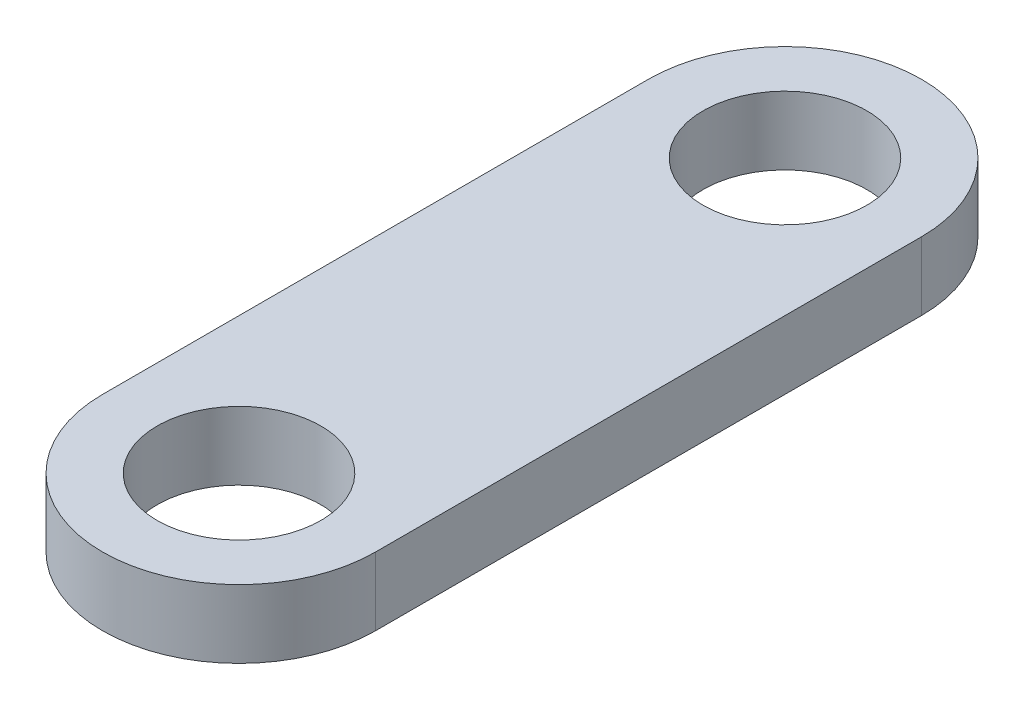
ISO-10303-21;
HEADER;
FILE_DESCRIPTION(('STEP AP214'),'2;1');
FILE_NAME('part.step','',(''),(''),'','','');
FILE_SCHEMA(('AUTOMOTIVE_DESIGN { 1 0 10303 214 1 1 1 1 }'));
ENDSEC;
DATA;
#1=APPLICATION_CONTEXT('core data for automotive mechanical design processes');
#2=APPLICATION_PROTOCOL_DEFINITION('international standard','automotive_design',2000,#1);
#3=PRODUCT_CONTEXT('',#1,'mechanical');
#4=PRODUCT('Part','Part','',(#3));
#5=PRODUCT_RELATED_PRODUCT_CATEGORY('part','',(#4));
#6=PRODUCT_DEFINITION_FORMATION('','',#4);
#7=PRODUCT_DEFINITION_CONTEXT('part definition',#1,'design');
#8=PRODUCT_DEFINITION('design','',#6,#7);
#9=PRODUCT_DEFINITION_SHAPE('','',#8);
#10=(LENGTH_UNIT() NAMED_UNIT(*) SI_UNIT(.MILLI.,.METRE.));
#11=(NAMED_UNIT(*) PLANE_ANGLE_UNIT() SI_UNIT($,.RADIAN.));
#12=(NAMED_UNIT(*) SI_UNIT($,.STERADIAN.) SOLID_ANGLE_UNIT());
#13=UNCERTAINTY_MEASURE_WITH_UNIT(LENGTH_MEASURE(1.E-05),#10,'distance_accuracy_value','');
#14=(GEOMETRIC_REPRESENTATION_CONTEXT(3) GLOBAL_UNCERTAINTY_ASSIGNED_CONTEXT((#13)) GLOBAL_UNIT_ASSIGNED_CONTEXT((#10,
#11,#12)) REPRESENTATION_CONTEXT('',''));
#15=CARTESIAN_POINT('',(0.,0.,0.));
#16=DIRECTION('',(0.,0.,1.));
#17=DIRECTION('',(1.,0.,0.));
#18=AXIS2_PLACEMENT_3D('',#15,#16,#17);
#19=CARTESIAN_POINT('',(0.,3.,0.));
#20=DIRECTION('',(0.,1.,0.));
#21=DIRECTION('',(0.,0.,1.));
#22=AXIS2_PLACEMENT_3D('',#19,#20,#21);
#23=PLANE('',#22);
#24=CARTESIAN_POINT('',(0.,3.,0.));
#25=DIRECTION('',(0.,1.,0.));
#26=DIRECTION('',(0.,0.,1.));
#27=AXIS2_PLACEMENT_3D('',#24,#25,#26);
#28=CIRCLE('',#27,3.6);
#29=CARTESIAN_POINT('',(0.,3.,3.6));
#30=VERTEX_POINT('',#29);
#31=EDGE_CURVE('E99',#30,#30,#28,.T.);
#32=ORIENTED_EDGE('',*,*,#31,.F.);
#33=EDGE_LOOP('',(#32));
#34=FACE_BOUND('',#33,.T.);
#35=CARTESIAN_POINT('',(0.,3.,0.));
#36=DIRECTION('',(0.,1.,0.));
#37=DIRECTION('',(0.,0.,1.));
#38=AXIS2_PLACEMENT_3D('',#35,#36,#37);
#39=CIRCLE('',#38,6.);
#40=CARTESIAN_POINT('',(6.,3.,0.));
#41=VERTEX_POINT('',#40);
#42=CARTESIAN_POINT('',(-6.,3.,0.));
#43=VERTEX_POINT('',#42);
#44=EDGE_CURVE('E84',#41,#43,#39,.T.);
#45=ORIENTED_EDGE('',*,*,#44,.T.);
#46=DIRECTION('',(0.,0.,1.));
#47=VECTOR('',#46,1.);
#48=CARTESIAN_POINT('',(-6.,3.,0.));
#49=LINE('',#48,#47);
#50=CARTESIAN_POINT('',(-6.,3.,24.));
#51=VERTEX_POINT('',#50);
#52=EDGE_CURVE('E79',#43,#51,#49,.T.);
#53=ORIENTED_EDGE('',*,*,#52,.T.);
#54=CARTESIAN_POINT('',(0.,3.,24.));
#55=DIRECTION('',(0.,1.,0.));
#56=DIRECTION('',(0.,0.,1.));
#57=AXIS2_PLACEMENT_3D('',#54,#55,#56);
#58=CIRCLE('',#57,6.);
#59=CARTESIAN_POINT('',(6.,3.,24.));
#60=VERTEX_POINT('',#59);
#61=EDGE_CURVE('E82',#51,#60,#58,.T.);
#62=ORIENTED_EDGE('',*,*,#61,.T.);
#63=DIRECTION('',(0.,0.,-1.));
#64=VECTOR('',#63,1.);
#65=CARTESIAN_POINT('',(6.,3.,0.));
#66=LINE('',#65,#64);
#67=EDGE_CURVE('E49',#60,#41,#66,.T.);
#68=ORIENTED_EDGE('',*,*,#67,.T.);
#69=EDGE_LOOP('',(#45,#53,#62,#68));
#70=FACE_BOUND('',#69,.T.);
#71=CARTESIAN_POINT('',(0.,3.,24.));
#72=DIRECTION('',(0.,1.,0.));
#73=DIRECTION('',(0.,0.,1.));
#74=AXIS2_PLACEMENT_3D('',#71,#72,#73);
#75=CIRCLE('',#74,3.6);
#76=CARTESIAN_POINT('',(0.,3.,27.6));
#77=VERTEX_POINT('',#76);
#78=EDGE_CURVE('E114',#77,#77,#75,.T.);
#79=ORIENTED_EDGE('',*,*,#78,.F.);
#80=EDGE_LOOP('',(#79));
#81=FACE_BOUND('',#80,.T.);
#82=ADVANCED_FACE('F32',(#34,#70,#81),#23,.T.);
#83=CARTESIAN_POINT('',(0.,0.,0.));
#84=DIRECTION('',(0.,1.,0.));
#85=DIRECTION('',(0.,0.,1.));
#86=AXIS2_PLACEMENT_3D('',#83,#84,#85);
#87=PLANE('',#86);
#88=CARTESIAN_POINT('',(0.,0.,0.));
#89=DIRECTION('',(0.,1.,0.));
#90=DIRECTION('',(0.,0.,1.));
#91=AXIS2_PLACEMENT_3D('',#88,#89,#90);
#92=CIRCLE('',#91,3.6);
#93=CARTESIAN_POINT('',(0.,0.,3.6));
#94=VERTEX_POINT('',#93);
#95=EDGE_CURVE('E111',#94,#94,#92,.T.);
#96=ORIENTED_EDGE('',*,*,#95,.T.);
#97=EDGE_LOOP('',(#96));
#98=FACE_BOUND('',#97,.T.);
#99=CARTESIAN_POINT('',(0.,0.,0.));
#100=DIRECTION('',(0.,1.,0.));
#101=DIRECTION('',(0.,0.,1.));
#102=AXIS2_PLACEMENT_3D('',#99,#100,#101);
#103=CIRCLE('',#102,6.);
#104=CARTESIAN_POINT('',(6.,0.,0.));
#105=VERTEX_POINT('',#104);
#106=CARTESIAN_POINT('',(-6.,0.,0.));
#107=VERTEX_POINT('',#106);
#108=EDGE_CURVE('E96',#105,#107,#103,.T.);
#109=ORIENTED_EDGE('',*,*,#108,.F.);
#110=DIRECTION('',(0.,0.,-1.));
#111=VECTOR('',#110,1.);
#112=CARTESIAN_POINT('',(6.,0.,0.));
#113=LINE('',#112,#111);
#114=CARTESIAN_POINT('',(6.,0.,24.));
#115=VERTEX_POINT('',#114);
#116=EDGE_CURVE('E72',#115,#105,#113,.T.);
#117=ORIENTED_EDGE('',*,*,#116,.F.);
#118=CARTESIAN_POINT('',(0.,0.,24.));
#119=DIRECTION('',(0.,1.,0.));
#120=DIRECTION('',(0.,0.,1.));
#121=AXIS2_PLACEMENT_3D('',#118,#119,#120);
#122=CIRCLE('',#121,6.);
#123=CARTESIAN_POINT('',(-6.,0.,24.));
#124=VERTEX_POINT('',#123);
#125=EDGE_CURVE('E66',#124,#115,#122,.T.);
#126=ORIENTED_EDGE('',*,*,#125,.F.);
#127=DIRECTION('',(0.,0.,1.));
#128=VECTOR('',#127,1.);
#129=CARTESIAN_POINT('',(-6.,0.,0.));
#130=LINE('',#129,#128);
#131=EDGE_CURVE('E88',#107,#124,#130,.T.);
#132=ORIENTED_EDGE('',*,*,#131,.F.);
#133=EDGE_LOOP('',(#109,#117,#126,#132));
#134=FACE_BOUND('',#133,.T.);
#135=CARTESIAN_POINT('',(0.,0.,24.));
#136=DIRECTION('',(0.,1.,0.));
#137=DIRECTION('',(0.,0.,1.));
#138=AXIS2_PLACEMENT_3D('',#135,#136,#137);
#139=CIRCLE('',#138,3.6);
#140=CARTESIAN_POINT('',(0.,0.,27.6));
#141=VERTEX_POINT('',#140);
#142=EDGE_CURVE('E117',#141,#141,#139,.T.);
#143=ORIENTED_EDGE('',*,*,#142,.T.);
#144=EDGE_LOOP('',(#143));
#145=FACE_BOUND('',#144,.T.);
#146=ADVANCED_FACE('F107',(#98,#134,#145),#87,.F.);
#147=CARTESIAN_POINT('',(0.,3.,0.));
#148=DIRECTION('',(0.,-1.,0.));
#149=DIRECTION('',(0.,0.,-1.));
#150=AXIS2_PLACEMENT_3D('',#147,#148,#149);
#151=CYLINDRICAL_SURFACE('',#150,6.);
#152=ORIENTED_EDGE('',*,*,#108,.T.);
#153=DIRECTION('',(0.,-1.,0.));
#154=VECTOR('',#153,1.);
#155=CARTESIAN_POINT('',(-6.,3.,0.));
#156=LINE('',#155,#154);
#157=EDGE_CURVE('E11',#43,#107,#156,.T.);
#158=ORIENTED_EDGE('',*,*,#157,.F.);
#159=ORIENTED_EDGE('',*,*,#44,.F.);
#160=DIRECTION('',(0.,-1.,0.));
#161=VECTOR('',#160,1.);
#162=CARTESIAN_POINT('',(6.,3.,0.));
#163=LINE('',#162,#161);
#164=EDGE_CURVE('E92',#41,#105,#163,.T.);
#165=ORIENTED_EDGE('',*,*,#164,.T.);
#166=EDGE_LOOP('',(#152,#158,#159,#165));
#167=FACE_BOUND('',#166,.T.);
#168=ADVANCED_FACE('F34',(#167),#151,.T.);
#169=CARTESIAN_POINT('',(-6.,3.,0.));
#170=DIRECTION('',(1.,0.,0.));
#171=DIRECTION('',(0.,0.,-1.));
#172=AXIS2_PLACEMENT_3D('',#169,#170,#171);
#173=PLANE('',#172);
#174=ORIENTED_EDGE('',*,*,#131,.T.);
#175=DIRECTION('',(0.,-1.,0.));
#176=VECTOR('',#175,1.);
#177=CARTESIAN_POINT('',(-6.,3.,24.));
#178=LINE('',#177,#176);
#179=EDGE_CURVE('E41',#51,#124,#178,.T.);
#180=ORIENTED_EDGE('',*,*,#179,.F.);
#181=ORIENTED_EDGE('',*,*,#52,.F.);
#182=ORIENTED_EDGE('',*,*,#157,.T.);
#183=EDGE_LOOP('',(#174,#180,#181,#182));
#184=FACE_BOUND('',#183,.T.);
#185=ADVANCED_FACE('F87',(#184),#173,.F.);
#186=CARTESIAN_POINT('',(0.,3.,24.));
#187=DIRECTION('',(0.,-1.,0.));
#188=DIRECTION('',(0.,0.,-1.));
#189=AXIS2_PLACEMENT_3D('',#186,#187,#188);
#190=CYLINDRICAL_SURFACE('',#189,6.);
#191=ORIENTED_EDGE('',*,*,#125,.T.);
#192=DIRECTION('',(0.,-1.,0.));
#193=VECTOR('',#192,1.);
#194=CARTESIAN_POINT('',(6.,3.,24.));
#195=LINE('',#194,#193);
#196=EDGE_CURVE('E89',#60,#115,#195,.T.);
#197=ORIENTED_EDGE('',*,*,#196,.F.);
#198=ORIENTED_EDGE('',*,*,#61,.F.);
#199=ORIENTED_EDGE('',*,*,#179,.T.);
#200=EDGE_LOOP('',(#191,#197,#198,#199));
#201=FACE_BOUND('',#200,.T.);
#202=ADVANCED_FACE('F90',(#201),#190,.T.);
#203=CARTESIAN_POINT('',(6.,3.,0.));
#204=DIRECTION('',(-1.,0.,0.));
#205=DIRECTION('',(0.,0.,1.));
#206=AXIS2_PLACEMENT_3D('',#203,#204,#205);
#207=PLANE('',#206);
#208=ORIENTED_EDGE('',*,*,#116,.T.);
#209=ORIENTED_EDGE('',*,*,#164,.F.);
#210=ORIENTED_EDGE('',*,*,#67,.F.);
#211=ORIENTED_EDGE('',*,*,#196,.T.);
#212=EDGE_LOOP('',(#208,#209,#210,#211));
#213=FACE_BOUND('',#212,.T.);
#214=ADVANCED_FACE('F104',(#213),#207,.F.);
#215=CARTESIAN_POINT('',(0.,3.,0.));
#216=DIRECTION('',(0.,-1.,0.));
#217=DIRECTION('',(0.,0.,-1.));
#218=AXIS2_PLACEMENT_3D('',#215,#216,#217);
#219=CYLINDRICAL_SURFACE('',#218,3.6);
#220=ORIENTED_EDGE('',*,*,#31,.T.);
#221=EDGE_LOOP('',(#220));
#222=FACE_BOUND('',#221,.T.);
#223=ORIENTED_EDGE('',*,*,#95,.F.);
#224=EDGE_LOOP('',(#223));
#225=FACE_BOUND('',#224,.T.);
#226=ADVANCED_FACE('F135',(#222,#225),#219,.F.);
#227=CARTESIAN_POINT('',(0.,3.,24.));
#228=DIRECTION('',(0.,-1.,0.));
#229=DIRECTION('',(0.,0.,-1.));
#230=AXIS2_PLACEMENT_3D('',#227,#228,#229);
#231=CYLINDRICAL_SURFACE('',#230,3.6);
#232=ORIENTED_EDGE('',*,*,#78,.T.);
#233=EDGE_LOOP('',(#232));
#234=FACE_BOUND('',#233,.T.);
#235=ORIENTED_EDGE('',*,*,#142,.F.);
#236=EDGE_LOOP('',(#235));
#237=FACE_BOUND('',#236,.T.);
#238=ADVANCED_FACE('F123',(#234,#237),#231,.F.);
#239=CLOSED_SHELL('',(#82,#146,#168,#185,#202,#214,#226,#238));
#240=MANIFOLD_SOLID_BREP('B2',#239);
#241=ADVANCED_BREP_SHAPE_REPRESENTATION('',(#18,#240),#14);
#242=SHAPE_DEFINITION_REPRESENTATION(#9,#241);
ENDSEC;
END-ISO-10303-21;
